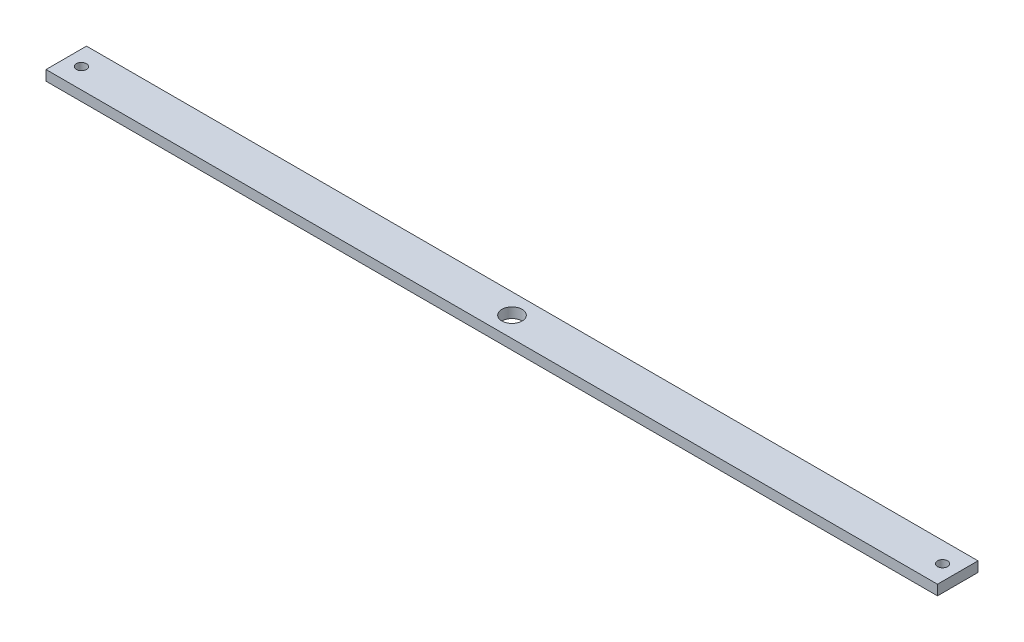
ISO-10303-21;
HEADER;
FILE_DESCRIPTION(('STEP AP214'),'2;1');
FILE_NAME('part.step','',(''),(''),'','','');
FILE_SCHEMA(('AUTOMOTIVE_DESIGN { 1 0 10303 214 1 1 1 1 }'));
ENDSEC;
DATA;
#1=APPLICATION_CONTEXT('core data for automotive mechanical design processes');
#2=APPLICATION_PROTOCOL_DEFINITION('international standard','automotive_design',2000,#1);
#3=PRODUCT_CONTEXT('',#1,'mechanical');
#4=PRODUCT('Part','Part','',(#3));
#5=PRODUCT_RELATED_PRODUCT_CATEGORY('part','',(#4));
#6=PRODUCT_DEFINITION_FORMATION('','',#4);
#7=PRODUCT_DEFINITION_CONTEXT('part definition',#1,'design');
#8=PRODUCT_DEFINITION('design','',#6,#7);
#9=PRODUCT_DEFINITION_SHAPE('','',#8);
#10=(LENGTH_UNIT() NAMED_UNIT(*) SI_UNIT(.MILLI.,.METRE.));
#11=(NAMED_UNIT(*) PLANE_ANGLE_UNIT() SI_UNIT($,.RADIAN.));
#12=(NAMED_UNIT(*) SI_UNIT($,.STERADIAN.) SOLID_ANGLE_UNIT());
#13=UNCERTAINTY_MEASURE_WITH_UNIT(LENGTH_MEASURE(1.E-05),#10,'distance_accuracy_value','');
#14=(GEOMETRIC_REPRESENTATION_CONTEXT(3) GLOBAL_UNCERTAINTY_ASSIGNED_CONTEXT((#13)) GLOBAL_UNIT_ASSIGNED_CONTEXT((#10,
#11,#12)) REPRESENTATION_CONTEXT('',''));
#15=CARTESIAN_POINT('',(0.,0.,0.));
#16=DIRECTION('',(0.,0.,1.));
#17=DIRECTION('',(1.,0.,0.));
#18=AXIS2_PLACEMENT_3D('',#15,#16,#17);
#19=CARTESIAN_POINT('',(279.4,6.35,12.7));
#20=DIRECTION('',(-1.,0.,0.));
#21=DIRECTION('',(0.,0.,1.));
#22=AXIS2_PLACEMENT_3D('',#19,#20,#21);
#23=PLANE('',#22);
#24=DIRECTION('',(0.,0.,-1.));
#25=VECTOR('',#24,1.);
#26=CARTESIAN_POINT('',(279.4,0.,12.7));
#27=LINE('',#26,#25);
#28=CARTESIAN_POINT('',(279.4,0.,12.7));
#29=VERTEX_POINT('',#28);
#30=CARTESIAN_POINT('',(279.4,0.,-12.7));
#31=VERTEX_POINT('',#30);
#32=EDGE_CURVE('E98',#29,#31,#27,.T.);
#33=ORIENTED_EDGE('',*,*,#32,.T.);
#34=DIRECTION('',(0.,-1.,0.));
#35=VECTOR('',#34,1.);
#36=CARTESIAN_POINT('',(279.4,6.35,-12.7));
#37=LINE('',#36,#35);
#38=CARTESIAN_POINT('',(279.4,6.35,-12.7));
#39=VERTEX_POINT('',#38);
#40=EDGE_CURVE('E11',#39,#31,#37,.T.);
#41=ORIENTED_EDGE('',*,*,#40,.F.);
#42=DIRECTION('',(0.,0.,-1.));
#43=VECTOR('',#42,1.);
#44=CARTESIAN_POINT('',(279.4,6.35,12.7));
#45=LINE('',#44,#43);
#46=CARTESIAN_POINT('',(279.4,6.35,12.7));
#47=VERTEX_POINT('',#46);
#48=EDGE_CURVE('E85',#47,#39,#45,.T.);
#49=ORIENTED_EDGE('',*,*,#48,.F.);
#50=DIRECTION('',(0.,-1.,0.));
#51=VECTOR('',#50,1.);
#52=CARTESIAN_POINT('',(279.4,6.35,12.7));
#53=LINE('',#52,#51);
#54=EDGE_CURVE('E94',#47,#29,#53,.T.);
#55=ORIENTED_EDGE('',*,*,#54,.T.);
#56=EDGE_LOOP('',(#33,#41,#49,#55));
#57=FACE_BOUND('',#56,.T.);
#58=ADVANCED_FACE('F33',(#57),#23,.F.);
#59=CARTESIAN_POINT('',(-279.4,6.35,-12.7));
#60=DIRECTION('',(0.,0.,1.));
#61=DIRECTION('',(1.,0.,0.));
#62=AXIS2_PLACEMENT_3D('',#59,#60,#61);
#63=PLANE('',#62);
#64=DIRECTION('',(-1.,0.,0.));
#65=VECTOR('',#64,1.);
#66=CARTESIAN_POINT('',(-279.4,0.,-12.7));
#67=LINE('',#66,#65);
#68=CARTESIAN_POINT('',(-279.4,0.,-12.7));
#69=VERTEX_POINT('',#68);
#70=EDGE_CURVE('E89',#31,#69,#67,.T.);
#71=ORIENTED_EDGE('',*,*,#70,.T.);
#72=DIRECTION('',(0.,-1.,0.));
#73=VECTOR('',#72,1.);
#74=CARTESIAN_POINT('',(-279.4,6.35,-12.7));
#75=LINE('',#74,#73);
#76=CARTESIAN_POINT('',(-279.4,6.35,-12.7));
#77=VERTEX_POINT('',#76);
#78=EDGE_CURVE('E42',#77,#69,#75,.T.);
#79=ORIENTED_EDGE('',*,*,#78,.F.);
#80=DIRECTION('',(-1.,0.,0.));
#81=VECTOR('',#80,1.);
#82=CARTESIAN_POINT('',(-279.4,6.35,-12.7));
#83=LINE('',#82,#81);
#84=EDGE_CURVE('E80',#39,#77,#83,.T.);
#85=ORIENTED_EDGE('',*,*,#84,.F.);
#86=ORIENTED_EDGE('',*,*,#40,.T.);
#87=EDGE_LOOP('',(#71,#79,#85,#86));
#88=FACE_BOUND('',#87,.T.);
#89=ADVANCED_FACE('F88',(#88),#63,.F.);
#90=CARTESIAN_POINT('',(-279.4,6.35,12.7));
#91=DIRECTION('',(1.,0.,0.));
#92=DIRECTION('',(0.,0.,-1.));
#93=AXIS2_PLACEMENT_3D('',#90,#91,#92);
#94=PLANE('',#93);
#95=DIRECTION('',(0.,0.,1.));
#96=VECTOR('',#95,1.);
#97=CARTESIAN_POINT('',(-279.4,0.,12.7));
#98=LINE('',#97,#96);
#99=CARTESIAN_POINT('',(-279.4,0.,12.7));
#100=VERTEX_POINT('',#99);
#101=EDGE_CURVE('E67',#69,#100,#98,.T.);
#102=ORIENTED_EDGE('',*,*,#101,.T.);
#103=DIRECTION('',(0.,-1.,0.));
#104=VECTOR('',#103,1.);
#105=CARTESIAN_POINT('',(-279.4,6.35,12.7));
#106=LINE('',#105,#104);
#107=CARTESIAN_POINT('',(-279.4,6.35,12.7));
#108=VERTEX_POINT('',#107);
#109=EDGE_CURVE('E90',#108,#100,#106,.T.);
#110=ORIENTED_EDGE('',*,*,#109,.F.);
#111=DIRECTION('',(0.,0.,1.));
#112=VECTOR('',#111,1.);
#113=CARTESIAN_POINT('',(-279.4,6.35,12.7));
#114=LINE('',#113,#112);
#115=EDGE_CURVE('E83',#77,#108,#114,.T.);
#116=ORIENTED_EDGE('',*,*,#115,.F.);
#117=ORIENTED_EDGE('',*,*,#78,.T.);
#118=EDGE_LOOP('',(#102,#110,#116,#117));
#119=FACE_BOUND('',#118,.T.);
#120=ADVANCED_FACE('F92',(#119),#94,.F.);
#121=CARTESIAN_POINT('',(-279.4,6.35,12.7));
#122=DIRECTION('',(0.,0.,-1.));
#123=DIRECTION('',(-1.,0.,0.));
#124=AXIS2_PLACEMENT_3D('',#121,#122,#123);
#125=PLANE('',#124);
#126=DIRECTION('',(1.,0.,0.));
#127=VECTOR('',#126,1.);
#128=CARTESIAN_POINT('',(-279.4,0.,12.7));
#129=LINE('',#128,#127);
#130=EDGE_CURVE('E73',#100,#29,#129,.T.);
#131=ORIENTED_EDGE('',*,*,#130,.T.);
#132=ORIENTED_EDGE('',*,*,#54,.F.);
#133=DIRECTION('',(1.,0.,0.));
#134=VECTOR('',#133,1.);
#135=CARTESIAN_POINT('',(-279.4,6.35,12.7));
#136=LINE('',#135,#134);
#137=EDGE_CURVE('E50',#108,#47,#136,.T.);
#138=ORIENTED_EDGE('',*,*,#137,.F.);
#139=ORIENTED_EDGE('',*,*,#109,.T.);
#140=EDGE_LOOP('',(#131,#132,#138,#139));
#141=FACE_BOUND('',#140,.T.);
#142=ADVANCED_FACE('F106',(#141),#125,.F.);
#143=CARTESIAN_POINT('',(0.,6.35,0.));
#144=DIRECTION('',(0.,-1.,0.));
#145=DIRECTION('',(0.,0.,-1.));
#146=AXIS2_PLACEMENT_3D('',#143,#144,#145);
#147=PLANE('',#146);
#148=CARTESIAN_POINT('',(0.,6.35,0.));
#149=DIRECTION('',(0.,1.,0.));
#150=DIRECTION('',(0.,0.,1.));
#151=AXIS2_PLACEMENT_3D('',#148,#149,#150);
#152=CIRCLE('',#151,6.35);
#153=CARTESIAN_POINT('',(0.,6.35,6.35));
#154=VERTEX_POINT('',#153);
#155=EDGE_CURVE('E121',#154,#154,#152,.T.);
#156=ORIENTED_EDGE('',*,*,#155,.F.);
#157=EDGE_LOOP('',(#156));
#158=FACE_BOUND('',#157,.T.);
#159=CARTESIAN_POINT('',(-269.875,6.35,0.));
#160=DIRECTION('',(0.,1.,0.));
#161=DIRECTION('',(0.,0.,1.));
#162=AXIS2_PLACEMENT_3D('',#159,#160,#161);
#163=CIRCLE('',#162,3.17499999999998);
#164=CARTESIAN_POINT('',(-269.875,6.35,3.17499999999998));
#165=VERTEX_POINT('',#164);
#166=EDGE_CURVE('E117',#165,#165,#163,.T.);
#167=ORIENTED_EDGE('',*,*,#166,.F.);
#168=EDGE_LOOP('',(#167));
#169=FACE_BOUND('',#168,.T.);
#170=CARTESIAN_POINT('',(269.875,6.35,0.));
#171=DIRECTION('',(0.,1.,0.));
#172=DIRECTION('',(0.,0.,1.));
#173=AXIS2_PLACEMENT_3D('',#170,#171,#172);
#174=CIRCLE('',#173,3.17499999999998);
#175=CARTESIAN_POINT('',(269.875,6.35,3.17499999999998));
#176=VERTEX_POINT('',#175);
#177=EDGE_CURVE('E114',#176,#176,#174,.T.);
#178=ORIENTED_EDGE('',*,*,#177,.F.);
#179=EDGE_LOOP('',(#178));
#180=FACE_BOUND('',#179,.T.);
#181=ORIENTED_EDGE('',*,*,#48,.T.);
#182=ORIENTED_EDGE('',*,*,#84,.T.);
#183=ORIENTED_EDGE('',*,*,#115,.T.);
#184=ORIENTED_EDGE('',*,*,#137,.T.);
#185=EDGE_LOOP('',(#181,#182,#183,#184));
#186=FACE_BOUND('',#185,.T.);
#187=ADVANCED_FACE('F81',(#158,#169,#180,#186),#147,.F.);
#188=CARTESIAN_POINT('',(0.,0.,0.));
#189=DIRECTION('',(0.,-1.,0.));
#190=DIRECTION('',(0.,0.,-1.));
#191=AXIS2_PLACEMENT_3D('',#188,#189,#190);
#192=PLANE('',#191);
#193=CARTESIAN_POINT('',(0.,0.,0.));
#194=DIRECTION('',(0.,1.,0.));
#195=DIRECTION('',(0.,0.,1.));
#196=AXIS2_PLACEMENT_3D('',#193,#194,#195);
#197=CIRCLE('',#196,6.35);
#198=CARTESIAN_POINT('',(0.,0.,6.35));
#199=VERTEX_POINT('',#198);
#200=EDGE_CURVE('E120',#199,#199,#197,.T.);
#201=ORIENTED_EDGE('',*,*,#200,.T.);
#202=EDGE_LOOP('',(#201));
#203=FACE_BOUND('',#202,.T.);
#204=CARTESIAN_POINT('',(-269.875,0.,0.));
#205=DIRECTION('',(0.,-1.,0.));
#206=DIRECTION('',(0.,0.,-1.));
#207=AXIS2_PLACEMENT_3D('',#204,#205,#206);
#208=CIRCLE('',#207,3.17499999999998);
#209=CARTESIAN_POINT('',(-269.875,0.,-3.17499999999998));
#210=VERTEX_POINT('',#209);
#211=EDGE_CURVE('E36',#210,#210,#208,.T.);
#212=ORIENTED_EDGE('',*,*,#211,.F.);
#213=EDGE_LOOP('',(#212));
#214=FACE_BOUND('',#213,.T.);
#215=CARTESIAN_POINT('',(269.875,0.,0.));
#216=DIRECTION('',(0.,-1.,0.));
#217=DIRECTION('',(0.,0.,-1.));
#218=AXIS2_PLACEMENT_3D('',#215,#216,#217);
#219=CIRCLE('',#218,3.17499999999998);
#220=CARTESIAN_POINT('',(269.875,0.,-3.17499999999999));
#221=VERTEX_POINT('',#220);
#222=EDGE_CURVE('E101',#221,#221,#219,.T.);
#223=ORIENTED_EDGE('',*,*,#222,.F.);
#224=EDGE_LOOP('',(#223));
#225=FACE_BOUND('',#224,.T.);
#226=ORIENTED_EDGE('',*,*,#32,.F.);
#227=ORIENTED_EDGE('',*,*,#130,.F.);
#228=ORIENTED_EDGE('',*,*,#101,.F.);
#229=ORIENTED_EDGE('',*,*,#70,.F.);
#230=EDGE_LOOP('',(#226,#227,#228,#229));
#231=FACE_BOUND('',#230,.T.);
#232=ADVANCED_FACE('F109',(#203,#214,#225,#231),#192,.T.);
#233=CARTESIAN_POINT('',(269.875,6.35,0.));
#234=DIRECTION('',(0.,1.,0.));
#235=DIRECTION('',(0.,0.,1.));
#236=AXIS2_PLACEMENT_3D('',#233,#234,#235);
#237=CYLINDRICAL_SURFACE('',#236,3.17499999999998);
#238=ORIENTED_EDGE('',*,*,#222,.T.);
#239=EDGE_LOOP('',(#238));
#240=FACE_BOUND('',#239,.T.);
#241=ORIENTED_EDGE('',*,*,#177,.T.);
#242=EDGE_LOOP('',(#241));
#243=FACE_BOUND('',#242,.T.);
#244=ADVANCED_FACE('F143',(#240,#243),#237,.F.);
#245=CARTESIAN_POINT('',(-269.875,6.35,0.));
#246=DIRECTION('',(0.,1.,0.));
#247=DIRECTION('',(0.,0.,1.));
#248=AXIS2_PLACEMENT_3D('',#245,#246,#247);
#249=CYLINDRICAL_SURFACE('',#248,3.17499999999998);
#250=ORIENTED_EDGE('',*,*,#211,.T.);
#251=EDGE_LOOP('',(#250));
#252=FACE_BOUND('',#251,.T.);
#253=ORIENTED_EDGE('',*,*,#166,.T.);
#254=EDGE_LOOP('',(#253));
#255=FACE_BOUND('',#254,.T.);
#256=ADVANCED_FACE('F132',(#252,#255),#249,.F.);
#257=CARTESIAN_POINT('',(0.,0.,0.));
#258=DIRECTION('',(0.,1.,0.));
#259=DIRECTION('',(0.,0.,1.));
#260=AXIS2_PLACEMENT_3D('',#257,#258,#259);
#261=CYLINDRICAL_SURFACE('',#260,6.35);
#262=ORIENTED_EDGE('',*,*,#200,.F.);
#263=EDGE_LOOP('',(#262));
#264=FACE_BOUND('',#263,.T.);
#265=ORIENTED_EDGE('',*,*,#155,.T.);
#266=EDGE_LOOP('',(#265));
#267=FACE_BOUND('',#266,.T.);
#268=ADVANCED_FACE('F129',(#264,#267),#261,.F.);
#269=CLOSED_SHELL('',(#58,#89,#120,#142,#187,#232,#244,#256,#268));
#270=MANIFOLD_SOLID_BREP('B2',#269);
#271=ADVANCED_BREP_SHAPE_REPRESENTATION('',(#18,#270),#14);
#272=SHAPE_DEFINITION_REPRESENTATION(#9,#271);
ENDSEC;
END-ISO-10303-21;
